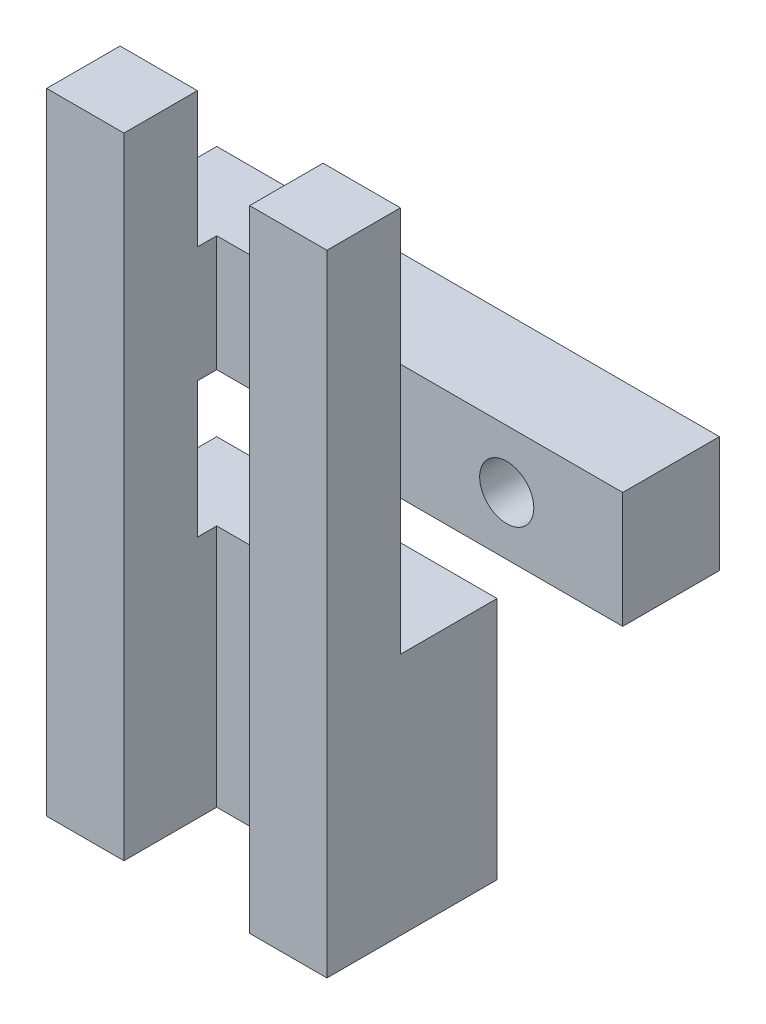
ISO-10303-21;
HEADER;
FILE_DESCRIPTION(('STEP AP214'),'2;1');
FILE_NAME('part.step','',(''),(''),'','','');
FILE_SCHEMA(('AUTOMOTIVE_DESIGN { 1 0 10303 214 1 1 1 1 }'));
ENDSEC;
DATA;
#1=APPLICATION_CONTEXT('core data for automotive mechanical design processes');
#2=APPLICATION_PROTOCOL_DEFINITION('international standard','automotive_design',2000,#1);
#3=PRODUCT_CONTEXT('',#1,'mechanical');
#4=PRODUCT('Part','Part','',(#3));
#5=PRODUCT_RELATED_PRODUCT_CATEGORY('part','',(#4));
#6=PRODUCT_DEFINITION_FORMATION('','',#4);
#7=PRODUCT_DEFINITION_CONTEXT('part definition',#1,'design');
#8=PRODUCT_DEFINITION('design','',#6,#7);
#9=PRODUCT_DEFINITION_SHAPE('','',#8);
#10=(LENGTH_UNIT() NAMED_UNIT(*) SI_UNIT(.MILLI.,.METRE.));
#11=(NAMED_UNIT(*) PLANE_ANGLE_UNIT() SI_UNIT($,.RADIAN.));
#12=(NAMED_UNIT(*) SI_UNIT($,.STERADIAN.) SOLID_ANGLE_UNIT());
#13=UNCERTAINTY_MEASURE_WITH_UNIT(LENGTH_MEASURE(1.E-05),#10,'distance_accuracy_value','');
#14=(GEOMETRIC_REPRESENTATION_CONTEXT(3) GLOBAL_UNCERTAINTY_ASSIGNED_CONTEXT((#13)) GLOBAL_UNIT_ASSIGNED_CONTEXT((#10,
#11,#12)) REPRESENTATION_CONTEXT('',''));
#15=CARTESIAN_POINT('',(0.,0.,0.));
#16=DIRECTION('',(0.,0.,1.));
#17=DIRECTION('',(1.,0.,0.));
#18=AXIS2_PLACEMENT_3D('',#15,#16,#17);
#19=CARTESIAN_POINT('',(0.,0.,5.));
#20=DIRECTION('',(0.,0.,1.));
#21=DIRECTION('',(1.,0.,0.));
#22=AXIS2_PLACEMENT_3D('',#19,#20,#21);
#23=PLANE('',#22);
#24=DIRECTION('',(1.,0.,0.));
#25=VECTOR('',#24,1.);
#26=CARTESIAN_POINT('',(14.5,-13.,5.));
#27=LINE('',#26,#25);
#28=CARTESIAN_POINT('',(0.,-13.,5.));
#29=VERTEX_POINT('',#28);
#30=CARTESIAN_POINT('',(4.,-13.,5.));
#31=VERTEX_POINT('',#30);
#32=EDGE_CURVE('E220',#29,#31,#27,.T.);
#33=ORIENTED_EDGE('',*,*,#32,.F.);
#34=DIRECTION('',(0.,-1.,0.));
#35=VECTOR('',#34,1.);
#36=CARTESIAN_POINT('',(0.,7.,5.));
#37=LINE('',#36,#35);
#38=CARTESIAN_POINT('',(0.,-6.,5.));
#39=VERTEX_POINT('',#38);
#40=EDGE_CURVE('E284',#39,#29,#37,.T.);
#41=ORIENTED_EDGE('',*,*,#40,.F.);
#42=DIRECTION('',(1.,0.,0.));
#43=VECTOR('',#42,1.);
#44=CARTESIAN_POINT('',(0.,-6.,5.));
#45=LINE('',#44,#43);
#46=CARTESIAN_POINT('',(4.,-6.,5.));
#47=VERTEX_POINT('',#46);
#48=EDGE_CURVE('E314',#39,#47,#45,.T.);
#49=ORIENTED_EDGE('',*,*,#48,.T.);
#50=DIRECTION('',(0.,1.,0.));
#51=VECTOR('',#50,1.);
#52=CARTESIAN_POINT('',(4.,7.,5.));
#53=LINE('',#52,#51);
#54=EDGE_CURVE('E299',#31,#47,#53,.T.);
#55=ORIENTED_EDGE('',*,*,#54,.F.);
#56=EDGE_LOOP('',(#33,#41,#49,#55));
#57=FACE_BOUND('',#56,.T.);
#58=ADVANCED_FACE('F41',(#57),#23,.F.);
#59=CARTESIAN_POINT('',(0.,0.,5.));
#60=DIRECTION('',(0.,0.,1.));
#61=DIRECTION('',(1.,0.,0.));
#62=AXIS2_PLACEMENT_3D('',#59,#60,#61);
#63=PLANE('',#62);
#64=CARTESIAN_POINT('',(10.5,-13.,5.));
#65=VERTEX_POINT('',#64);
#66=CARTESIAN_POINT('',(14.5,-13.,5.));
#67=VERTEX_POINT('',#66);
#68=EDGE_CURVE('E214',#65,#67,#27,.T.);
#69=ORIENTED_EDGE('',*,*,#68,.F.);
#70=DIRECTION('',(0.,-1.,0.));
#71=VECTOR('',#70,1.);
#72=CARTESIAN_POINT('',(10.5,7.,5.));
#73=LINE('',#72,#71);
#74=CARTESIAN_POINT('',(10.5,-6.,5.));
#75=VERTEX_POINT('',#74);
#76=EDGE_CURVE('E269',#75,#65,#73,.T.);
#77=ORIENTED_EDGE('',*,*,#76,.F.);
#78=DIRECTION('',(1.,0.,0.));
#79=VECTOR('',#78,1.);
#80=CARTESIAN_POINT('',(0.,-6.,5.));
#81=LINE('',#80,#79);
#82=CARTESIAN_POINT('',(14.5,-6.,5.));
#83=VERTEX_POINT('',#82);
#84=EDGE_CURVE('E274',#75,#83,#81,.T.);
#85=ORIENTED_EDGE('',*,*,#84,.T.);
#86=DIRECTION('',(0.,1.,0.));
#87=VECTOR('',#86,1.);
#88=CARTESIAN_POINT('',(14.5,7.,5.));
#89=LINE('',#88,#87);
#90=EDGE_CURVE('E267',#67,#83,#89,.T.);
#91=ORIENTED_EDGE('',*,*,#90,.F.);
#92=EDGE_LOOP('',(#69,#77,#85,#91));
#93=FACE_BOUND('',#92,.T.);
#94=ADVANCED_FACE('F395',(#93),#63,.F.);
#95=CARTESIAN_POINT('',(0.,0.,5.));
#96=DIRECTION('',(0.,0.,1.));
#97=DIRECTION('',(1.,0.,0.));
#98=AXIS2_PLACEMENT_3D('',#95,#96,#97);
#99=PLANE('',#98);
#100=CARTESIAN_POINT('',(20.,-3.,5.));
#101=DIRECTION('',(0.,0.,1.));
#102=DIRECTION('',(1.,0.,0.));
#103=AXIS2_PLACEMENT_3D('',#100,#101,#102);
#104=CIRCLE('',#103,1.4);
#105=CARTESIAN_POINT('',(21.4,-3.,5.));
#106=VERTEX_POINT('',#105);
#107=EDGE_CURVE('E308',#106,#106,#104,.T.);
#108=ORIENTED_EDGE('',*,*,#107,.F.);
#109=EDGE_LOOP('',(#108));
#110=FACE_BOUND('',#109,.T.);
#111=DIRECTION('',(-1.,0.,0.));
#112=VECTOR('',#111,1.);
#113=CARTESIAN_POINT('',(0.,0.,5.));
#114=LINE('',#113,#112);
#115=CARTESIAN_POINT('',(26.,0.,5.));
#116=VERTEX_POINT('',#115);
#117=CARTESIAN_POINT('',(14.5,0.,5.));
#118=VERTEX_POINT('',#117);
#119=EDGE_CURVE('E321',#116,#118,#114,.T.);
#120=ORIENTED_EDGE('',*,*,#119,.T.);
#121=EDGE_CURVE('E270',#83,#118,#89,.T.);
#122=ORIENTED_EDGE('',*,*,#121,.F.);
#123=CARTESIAN_POINT('',(26.,-6.,5.));
#124=VERTEX_POINT('',#123);
#125=EDGE_CURVE('E318',#83,#124,#45,.T.);
#126=ORIENTED_EDGE('',*,*,#125,.T.);
#127=DIRECTION('',(0.,1.,0.));
#128=VECTOR('',#127,1.);
#129=CARTESIAN_POINT('',(26.,0.,5.));
#130=LINE('',#129,#128);
#131=EDGE_CURVE('E317',#124,#116,#130,.T.);
#132=ORIENTED_EDGE('',*,*,#131,.T.);
#133=EDGE_LOOP('',(#120,#122,#126,#132));
#134=FACE_BOUND('',#133,.T.);
#135=ADVANCED_FACE('F387',(#110,#134),#99,.T.);
#136=CARTESIAN_POINT('',(0.,0.,0.));
#137=DIRECTION('',(0.,0.,1.));
#138=DIRECTION('',(1.,0.,0.));
#139=AXIS2_PLACEMENT_3D('',#136,#137,#138);
#140=PLANE('',#139);
#141=DIRECTION('',(0.,-1.,0.));
#142=VECTOR('',#141,1.);
#143=CARTESIAN_POINT('',(0.,0.,0.));
#144=LINE('',#143,#142);
#145=CARTESIAN_POINT('',(0.,0.,0.));
#146=VERTEX_POINT('',#145);
#147=CARTESIAN_POINT('',(0.,-6.,0.));
#148=VERTEX_POINT('',#147);
#149=EDGE_CURVE('E311',#146,#148,#144,.T.);
#150=ORIENTED_EDGE('',*,*,#149,.F.);
#151=DIRECTION('',(-1.,0.,0.));
#152=VECTOR('',#151,1.);
#153=CARTESIAN_POINT('',(0.,0.,0.));
#154=LINE('',#153,#152);
#155=CARTESIAN_POINT('',(26.,0.,0.));
#156=VERTEX_POINT('',#155);
#157=EDGE_CURVE('E332',#156,#146,#154,.T.);
#158=ORIENTED_EDGE('',*,*,#157,.F.);
#159=DIRECTION('',(0.,1.,0.));
#160=VECTOR('',#159,1.);
#161=CARTESIAN_POINT('',(26.,0.,0.));
#162=LINE('',#161,#160);
#163=CARTESIAN_POINT('',(26.,-6.,0.));
#164=VERTEX_POINT('',#163);
#165=EDGE_CURVE('E330',#164,#156,#162,.T.);
#166=ORIENTED_EDGE('',*,*,#165,.F.);
#167=DIRECTION('',(1.,0.,0.));
#168=VECTOR('',#167,1.);
#169=CARTESIAN_POINT('',(0.,-6.,0.));
#170=LINE('',#169,#168);
#171=EDGE_CURVE('E328',#148,#164,#170,.T.);
#172=ORIENTED_EDGE('',*,*,#171,.F.);
#173=EDGE_LOOP('',(#150,#158,#166,#172));
#174=FACE_BOUND('',#173,.T.);
#175=CARTESIAN_POINT('',(20.,-3.,0.));
#176=DIRECTION('',(0.,0.,1.));
#177=DIRECTION('',(1.,0.,0.));
#178=AXIS2_PLACEMENT_3D('',#175,#176,#177);
#179=CIRCLE('',#178,1.4);
#180=CARTESIAN_POINT('',(21.4,-3.,0.));
#181=VERTEX_POINT('',#180);
#182=EDGE_CURVE('E307',#181,#181,#179,.T.);
#183=ORIENTED_EDGE('',*,*,#182,.T.);
#184=EDGE_LOOP('',(#183));
#185=FACE_BOUND('',#184,.T.);
#186=ADVANCED_FACE('F350',(#174,#185),#140,.F.);
#187=CARTESIAN_POINT('',(0.,0.,5.));
#188=DIRECTION('',(1.,0.,0.));
#189=DIRECTION('',(0.,1.,0.));
#190=AXIS2_PLACEMENT_3D('',#187,#188,#189);
#191=PLANE('',#190);
#192=ORIENTED_EDGE('',*,*,#149,.T.);
#193=DIRECTION('',(0.,0.,-1.));
#194=VECTOR('',#193,1.);
#195=CARTESIAN_POINT('',(0.,-6.,5.));
#196=LINE('',#195,#194);
#197=EDGE_CURVE('E11',#39,#148,#196,.T.);
#198=ORIENTED_EDGE('',*,*,#197,.F.);
#199=ORIENTED_EDGE('',*,*,#40,.T.);
#200=DIRECTION('',(0.,0.,1.));
#201=VECTOR('',#200,1.);
#202=CARTESIAN_POINT('',(0.,-13.,0.));
#203=LINE('',#202,#201);
#204=CARTESIAN_POINT('',(0.,-13.,0.));
#205=VERTEX_POINT('',#204);
#206=EDGE_CURVE('E230',#205,#29,#203,.T.);
#207=ORIENTED_EDGE('',*,*,#206,.F.);
#208=DIRECTION('',(0.,1.,0.));
#209=VECTOR('',#208,1.);
#210=CARTESIAN_POINT('',(0.,-13.,0.));
#211=LINE('',#210,#209);
#212=CARTESIAN_POINT('',(0.,-25.6,0.));
#213=VERTEX_POINT('',#212);
#214=EDGE_CURVE('E223',#213,#205,#211,.T.);
#215=ORIENTED_EDGE('',*,*,#214,.F.);
#216=DIRECTION('',(0.,0.,-1.));
#217=VECTOR('',#216,1.);
#218=CARTESIAN_POINT('',(0.,-25.6,8.8));
#219=LINE('',#218,#217);
#220=CARTESIAN_POINT('',(0.,-25.6,8.8));
#221=VERTEX_POINT('',#220);
#222=EDGE_CURVE('E195',#221,#213,#219,.T.);
#223=ORIENTED_EDGE('',*,*,#222,.F.);
#224=DIRECTION('',(0.,-1.,0.));
#225=VECTOR('',#224,1.);
#226=CARTESIAN_POINT('',(0.,7.,8.8));
#227=LINE('',#226,#225);
#228=CARTESIAN_POINT('',(0.,7.,8.8));
#229=VERTEX_POINT('',#228);
#230=EDGE_CURVE('E285',#229,#221,#227,.T.);
#231=ORIENTED_EDGE('',*,*,#230,.F.);
#232=DIRECTION('',(0.,0.,-1.));
#233=VECTOR('',#232,1.);
#234=CARTESIAN_POINT('',(0.,7.,8.8));
#235=LINE('',#234,#233);
#236=CARTESIAN_POINT('',(0.,7.,5.));
#237=VERTEX_POINT('',#236);
#238=EDGE_CURVE('E294',#229,#237,#235,.T.);
#239=ORIENTED_EDGE('',*,*,#238,.T.);
#240=CARTESIAN_POINT('',(0.,0.,5.));
#241=VERTEX_POINT('',#240);
#242=EDGE_CURVE('E295',#237,#241,#37,.T.);
#243=ORIENTED_EDGE('',*,*,#242,.T.);
#244=DIRECTION('',(0.,0.,-1.));
#245=VECTOR('',#244,1.);
#246=CARTESIAN_POINT('',(0.,0.,5.));
#247=LINE('',#246,#245);
#248=EDGE_CURVE('E324',#241,#146,#247,.T.);
#249=ORIENTED_EDGE('',*,*,#248,.T.);
#250=EDGE_LOOP('',(#192,#198,#199,#207,#215,#223,#231,#239,#243,#249));
#251=FACE_BOUND('',#250,.T.);
#252=ADVANCED_FACE('F43',(#251),#191,.F.);
#253=CARTESIAN_POINT('',(0.,-6.,5.));
#254=DIRECTION('',(0.,1.,0.));
#255=DIRECTION('',(0.,0.,1.));
#256=AXIS2_PLACEMENT_3D('',#253,#254,#255);
#257=PLANE('',#256);
#258=DIRECTION('',(1.,0.,0.));
#259=VECTOR('',#258,1.);
#260=CARTESIAN_POINT('',(4.,-6.,4.));
#261=LINE('',#260,#259);
#262=CARTESIAN_POINT('',(4.,-6.,4.));
#263=VERTEX_POINT('',#262);
#264=CARTESIAN_POINT('',(10.5,-6.,4.));
#265=VERTEX_POINT('',#264);
#266=EDGE_CURVE('E235',#263,#265,#261,.T.);
#267=ORIENTED_EDGE('',*,*,#266,.F.);
#268=DIRECTION('',(0.,0.,1.));
#269=VECTOR('',#268,1.);
#270=CARTESIAN_POINT('',(4.,-6.,4.));
#271=LINE('',#270,#269);
#272=EDGE_CURVE('E244',#263,#47,#271,.T.);
#273=ORIENTED_EDGE('',*,*,#272,.T.);
#274=ORIENTED_EDGE('',*,*,#48,.F.);
#275=ORIENTED_EDGE('',*,*,#197,.T.);
#276=ORIENTED_EDGE('',*,*,#171,.T.);
#277=DIRECTION('',(0.,0.,-1.));
#278=VECTOR('',#277,1.);
#279=CARTESIAN_POINT('',(26.,-6.,5.));
#280=LINE('',#279,#278);
#281=EDGE_CURVE('E49',#124,#164,#280,.T.);
#282=ORIENTED_EDGE('',*,*,#281,.F.);
#283=ORIENTED_EDGE('',*,*,#125,.F.);
#284=ORIENTED_EDGE('',*,*,#84,.F.);
#285=DIRECTION('',(0.,0.,1.));
#286=VECTOR('',#285,1.);
#287=CARTESIAN_POINT('',(10.5,-6.,4.));
#288=LINE('',#287,#286);
#289=EDGE_CURVE('E249',#265,#75,#288,.T.);
#290=ORIENTED_EDGE('',*,*,#289,.F.);
#291=EDGE_LOOP('',(#267,#273,#274,#275,#276,#282,#283,#284,#290));
#292=FACE_BOUND('',#291,.T.);
#293=ADVANCED_FACE('F390',(#292),#257,.F.);
#294=CARTESIAN_POINT('',(26.,0.,5.));
#295=DIRECTION('',(-1.,0.,0.));
#296=DIRECTION('',(0.,0.,1.));
#297=AXIS2_PLACEMENT_3D('',#294,#295,#296);
#298=PLANE('',#297);
#299=ORIENTED_EDGE('',*,*,#165,.T.);
#300=DIRECTION('',(0.,0.,-1.));
#301=VECTOR('',#300,1.);
#302=CARTESIAN_POINT('',(26.,0.,5.));
#303=LINE('',#302,#301);
#304=EDGE_CURVE('E336',#116,#156,#303,.T.);
#305=ORIENTED_EDGE('',*,*,#304,.F.);
#306=ORIENTED_EDGE('',*,*,#131,.F.);
#307=ORIENTED_EDGE('',*,*,#281,.T.);
#308=EDGE_LOOP('',(#299,#305,#306,#307));
#309=FACE_BOUND('',#308,.T.);
#310=ADVANCED_FACE('F343',(#309),#298,.F.);
#311=CARTESIAN_POINT('',(0.,0.,5.));
#312=DIRECTION('',(0.,-1.,0.));
#313=DIRECTION('',(0.,0.,-1.));
#314=AXIS2_PLACEMENT_3D('',#311,#312,#313);
#315=PLANE('',#314);
#316=CARTESIAN_POINT('',(4.,0.,5.));
#317=VERTEX_POINT('',#316);
#318=EDGE_CURVE('E320',#317,#241,#114,.T.);
#319=ORIENTED_EDGE('',*,*,#318,.F.);
#320=DIRECTION('',(0.,0.,1.));
#321=VECTOR('',#320,1.);
#322=CARTESIAN_POINT('',(4.,0.,4.));
#323=LINE('',#322,#321);
#324=CARTESIAN_POINT('',(4.,0.,4.));
#325=VERTEX_POINT('',#324);
#326=EDGE_CURVE('E245',#325,#317,#323,.T.);
#327=ORIENTED_EDGE('',*,*,#326,.F.);
#328=DIRECTION('',(-1.,0.,0.));
#329=VECTOR('',#328,1.);
#330=CARTESIAN_POINT('',(4.,0.,4.));
#331=LINE('',#330,#329);
#332=CARTESIAN_POINT('',(10.5,0.,4.));
#333=VERTEX_POINT('',#332);
#334=EDGE_CURVE('E241',#333,#325,#331,.T.);
#335=ORIENTED_EDGE('',*,*,#334,.F.);
#336=DIRECTION('',(0.,0.,1.));
#337=VECTOR('',#336,1.);
#338=CARTESIAN_POINT('',(10.5,0.,4.));
#339=LINE('',#338,#337);
#340=CARTESIAN_POINT('',(10.5,0.,5.));
#341=VERTEX_POINT('',#340);
#342=EDGE_CURVE('E247',#333,#341,#339,.T.);
#343=ORIENTED_EDGE('',*,*,#342,.T.);
#344=EDGE_CURVE('E325',#118,#341,#114,.T.);
#345=ORIENTED_EDGE('',*,*,#344,.F.);
#346=ORIENTED_EDGE('',*,*,#119,.F.);
#347=ORIENTED_EDGE('',*,*,#304,.T.);
#348=ORIENTED_EDGE('',*,*,#157,.T.);
#349=ORIENTED_EDGE('',*,*,#248,.F.);
#350=EDGE_LOOP('',(#319,#327,#335,#343,#345,#346,#347,#348,#349));
#351=FACE_BOUND('',#350,.T.);
#352=ADVANCED_FACE('F354',(#351),#315,.F.);
#353=CARTESIAN_POINT('',(20.,-3.,5.));
#354=DIRECTION('',(0.,0.,-1.));
#355=DIRECTION('',(-1.,0.,0.));
#356=AXIS2_PLACEMENT_3D('',#353,#354,#355);
#357=CYLINDRICAL_SURFACE('',#356,1.4);
#358=ORIENTED_EDGE('',*,*,#107,.T.);
#359=EDGE_LOOP('',(#358));
#360=FACE_BOUND('',#359,.T.);
#361=ORIENTED_EDGE('',*,*,#182,.F.);
#362=EDGE_LOOP('',(#361));
#363=FACE_BOUND('',#362,.T.);
#364=ADVANCED_FACE('F437',(#360,#363),#357,.F.);
#365=CARTESIAN_POINT('',(4.,7.,5.));
#366=VERTEX_POINT('',#365);
#367=EDGE_CURVE('E298',#317,#366,#53,.T.);
#368=ORIENTED_EDGE('',*,*,#367,.F.);
#369=ORIENTED_EDGE('',*,*,#318,.T.);
#370=ORIENTED_EDGE('',*,*,#242,.F.);
#371=DIRECTION('',(-1.,0.,0.));
#372=VECTOR('',#371,1.);
#373=CARTESIAN_POINT('',(0.,7.,5.));
#374=LINE('',#373,#372);
#375=EDGE_CURVE('E289',#366,#237,#374,.T.);
#376=ORIENTED_EDGE('',*,*,#375,.F.);
#377=EDGE_LOOP('',(#368,#369,#370,#376));
#378=FACE_BOUND('',#377,.T.);
#379=ADVANCED_FACE('F365',(#378),#23,.F.);
#380=CARTESIAN_POINT('',(0.,-25.6,8.8));
#381=DIRECTION('',(0.,1.,0.));
#382=DIRECTION('',(0.,0.,1.));
#383=AXIS2_PLACEMENT_3D('',#380,#381,#382);
#384=PLANE('',#383);
#385=DIRECTION('',(1.,0.,0.));
#386=VECTOR('',#385,1.);
#387=CARTESIAN_POINT('',(4.,-25.6,4.));
#388=LINE('',#387,#386);
#389=CARTESIAN_POINT('',(4.,-25.6,4.));
#390=VERTEX_POINT('',#389);
#391=CARTESIAN_POINT('',(10.5,-25.6,4.));
#392=VERTEX_POINT('',#391);
#393=EDGE_CURVE('E199',#390,#392,#388,.T.);
#394=ORIENTED_EDGE('',*,*,#393,.F.);
#395=DIRECTION('',(0.,0.,-1.));
#396=VECTOR('',#395,1.);
#397=CARTESIAN_POINT('',(4.,-25.6,8.8));
#398=LINE('',#397,#396);
#399=CARTESIAN_POINT('',(4.,-25.6,8.8));
#400=VERTEX_POINT('',#399);
#401=EDGE_CURVE('E187',#400,#390,#398,.T.);
#402=ORIENTED_EDGE('',*,*,#401,.F.);
#403=DIRECTION('',(1.,0.,0.));
#404=VECTOR('',#403,1.);
#405=CARTESIAN_POINT('',(0.,-25.6,8.8));
#406=LINE('',#405,#404);
#407=EDGE_CURVE('E288',#221,#400,#406,.T.);
#408=ORIENTED_EDGE('',*,*,#407,.F.);
#409=ORIENTED_EDGE('',*,*,#222,.T.);
#410=DIRECTION('',(-1.,0.,0.));
#411=VECTOR('',#410,1.);
#412=CARTESIAN_POINT('',(14.5,-25.6,0.));
#413=LINE('',#412,#411);
#414=CARTESIAN_POINT('',(14.5,-25.6,0.));
#415=VERTEX_POINT('',#414);
#416=EDGE_CURVE('E219',#415,#213,#413,.T.);
#417=ORIENTED_EDGE('',*,*,#416,.F.);
#418=DIRECTION('',(0.,0.,-1.));
#419=VECTOR('',#418,1.);
#420=CARTESIAN_POINT('',(14.5,-25.6,8.8));
#421=LINE('',#420,#419);
#422=CARTESIAN_POINT('',(14.5,-25.6,8.8));
#423=VERTEX_POINT('',#422);
#424=EDGE_CURVE('E254',#423,#415,#421,.T.);
#425=ORIENTED_EDGE('',*,*,#424,.F.);
#426=DIRECTION('',(1.,0.,0.));
#427=VECTOR('',#426,1.);
#428=CARTESIAN_POINT('',(10.5,-25.6,8.8));
#429=LINE('',#428,#427);
#430=CARTESIAN_POINT('',(10.5,-25.6,8.8));
#431=VERTEX_POINT('',#430);
#432=EDGE_CURVE('E278',#431,#423,#429,.T.);
#433=ORIENTED_EDGE('',*,*,#432,.F.);
#434=DIRECTION('',(0.,0.,-1.));
#435=VECTOR('',#434,1.);
#436=CARTESIAN_POINT('',(10.5,-25.6,8.8));
#437=LINE('',#436,#435);
#438=EDGE_CURVE('E206',#431,#392,#437,.T.);
#439=ORIENTED_EDGE('',*,*,#438,.T.);
#440=EDGE_LOOP('',(#394,#402,#408,#409,#417,#425,#433,#439));
#441=FACE_BOUND('',#440,.T.);
#442=ADVANCED_FACE('F204',(#441),#384,.F.);
#443=CARTESIAN_POINT('',(4.,7.,8.8));
#444=DIRECTION('',(-1.,0.,0.));
#445=DIRECTION('',(0.,-1.,0.));
#446=AXIS2_PLACEMENT_3D('',#443,#444,#445);
#447=PLANE('',#446);
#448=ORIENTED_EDGE('',*,*,#401,.T.);
#449=DIRECTION('',(0.,-1.,0.));
#450=VECTOR('',#449,1.);
#451=CARTESIAN_POINT('',(4.,-13.,4.));
#452=LINE('',#451,#450);
#453=CARTESIAN_POINT('',(4.,-13.,4.));
#454=VERTEX_POINT('',#453);
#455=EDGE_CURVE('E190',#454,#390,#452,.T.);
#456=ORIENTED_EDGE('',*,*,#455,.F.);
#457=DIRECTION('',(0.,0.,1.));
#458=VECTOR('',#457,1.);
#459=CARTESIAN_POINT('',(4.,-13.,4.));
#460=LINE('',#459,#458);
#461=EDGE_CURVE('E212',#454,#31,#460,.T.);
#462=ORIENTED_EDGE('',*,*,#461,.T.);
#463=ORIENTED_EDGE('',*,*,#54,.T.);
#464=ORIENTED_EDGE('',*,*,#272,.F.);
#465=DIRECTION('',(0.,-1.,0.));
#466=VECTOR('',#465,1.);
#467=CARTESIAN_POINT('',(4.,0.,4.));
#468=LINE('',#467,#466);
#469=EDGE_CURVE('E232',#325,#263,#468,.T.);
#470=ORIENTED_EDGE('',*,*,#469,.F.);
#471=ORIENTED_EDGE('',*,*,#326,.T.);
#472=ORIENTED_EDGE('',*,*,#367,.T.);
#473=DIRECTION('',(0.,0.,-1.));
#474=VECTOR('',#473,1.);
#475=CARTESIAN_POINT('',(4.,7.,8.8));
#476=LINE('',#475,#474);
#477=CARTESIAN_POINT('',(4.,7.,8.8));
#478=VERTEX_POINT('',#477);
#479=EDGE_CURVE('E196',#478,#366,#476,.T.);
#480=ORIENTED_EDGE('',*,*,#479,.F.);
#481=DIRECTION('',(0.,1.,0.));
#482=VECTOR('',#481,1.);
#483=CARTESIAN_POINT('',(4.,7.,8.8));
#484=LINE('',#483,#482);
#485=EDGE_CURVE('E192',#400,#478,#484,.T.);
#486=ORIENTED_EDGE('',*,*,#485,.F.);
#487=EDGE_LOOP('',(#448,#456,#462,#463,#464,#470,#471,#472,#480,#486));
#488=FACE_BOUND('',#487,.T.);
#489=ADVANCED_FACE('F189',(#488),#447,.F.);
#490=CARTESIAN_POINT('',(0.,7.,8.8));
#491=DIRECTION('',(0.,-1.,0.));
#492=DIRECTION('',(0.,0.,-1.));
#493=AXIS2_PLACEMENT_3D('',#490,#491,#492);
#494=PLANE('',#493);
#495=ORIENTED_EDGE('',*,*,#375,.T.);
#496=ORIENTED_EDGE('',*,*,#238,.F.);
#497=DIRECTION('',(-1.,0.,0.));
#498=VECTOR('',#497,1.);
#499=CARTESIAN_POINT('',(0.,7.,8.8));
#500=LINE('',#499,#498);
#501=EDGE_CURVE('E292',#478,#229,#500,.T.);
#502=ORIENTED_EDGE('',*,*,#501,.F.);
#503=ORIENTED_EDGE('',*,*,#479,.T.);
#504=EDGE_LOOP('',(#495,#496,#502,#503));
#505=FACE_BOUND('',#504,.T.);
#506=ADVANCED_FACE('F419',(#505),#494,.F.);
#507=CARTESIAN_POINT('',(0.,0.,8.8));
#508=DIRECTION('',(0.,0.,1.));
#509=DIRECTION('',(1.,0.,0.));
#510=AXIS2_PLACEMENT_3D('',#507,#508,#509);
#511=PLANE('',#510);
#512=ORIENTED_EDGE('',*,*,#230,.T.);
#513=ORIENTED_EDGE('',*,*,#407,.T.);
#514=ORIENTED_EDGE('',*,*,#485,.T.);
#515=ORIENTED_EDGE('',*,*,#501,.T.);
#516=EDGE_LOOP('',(#512,#513,#514,#515));
#517=FACE_BOUND('',#516,.T.);
#518=ADVANCED_FACE('F416',(#517),#511,.T.);
#519=CARTESIAN_POINT('',(14.5,7.,5.));
#520=VERTEX_POINT('',#519);
#521=EDGE_CURVE('E265',#118,#520,#89,.T.);
#522=ORIENTED_EDGE('',*,*,#521,.F.);
#523=ORIENTED_EDGE('',*,*,#344,.T.);
#524=CARTESIAN_POINT('',(10.5,7.,5.));
#525=VERTEX_POINT('',#524);
#526=EDGE_CURVE('E271',#525,#341,#73,.T.);
#527=ORIENTED_EDGE('',*,*,#526,.F.);
#528=DIRECTION('',(-1.,0.,0.));
#529=VECTOR('',#528,1.);
#530=CARTESIAN_POINT('',(10.5,7.,5.));
#531=LINE('',#530,#529);
#532=EDGE_CURVE('E263',#520,#525,#531,.T.);
#533=ORIENTED_EDGE('',*,*,#532,.F.);
#534=EDGE_LOOP('',(#522,#523,#527,#533));
#535=FACE_BOUND('',#534,.T.);
#536=ADVANCED_FACE('F371',(#535),#63,.F.);
#537=CARTESIAN_POINT('',(10.5,7.,8.8));
#538=DIRECTION('',(1.,0.,0.));
#539=DIRECTION('',(0.,1.,0.));
#540=AXIS2_PLACEMENT_3D('',#537,#538,#539);
#541=PLANE('',#540);
#542=ORIENTED_EDGE('',*,*,#526,.T.);
#543=ORIENTED_EDGE('',*,*,#342,.F.);
#544=DIRECTION('',(0.,1.,0.));
#545=VECTOR('',#544,1.);
#546=CARTESIAN_POINT('',(10.5,0.,4.));
#547=LINE('',#546,#545);
#548=EDGE_CURVE('E238',#265,#333,#547,.T.);
#549=ORIENTED_EDGE('',*,*,#548,.F.);
#550=ORIENTED_EDGE('',*,*,#289,.T.);
#551=ORIENTED_EDGE('',*,*,#76,.T.);
#552=DIRECTION('',(0.,0.,1.));
#553=VECTOR('',#552,1.);
#554=CARTESIAN_POINT('',(10.5,-13.,4.));
#555=LINE('',#554,#553);
#556=CARTESIAN_POINT('',(10.5,-13.,4.));
#557=VERTEX_POINT('',#556);
#558=EDGE_CURVE('E211',#557,#65,#555,.T.);
#559=ORIENTED_EDGE('',*,*,#558,.F.);
#560=DIRECTION('',(0.,1.,0.));
#561=VECTOR('',#560,1.);
#562=CARTESIAN_POINT('',(10.5,-13.,4.));
#563=LINE('',#562,#561);
#564=EDGE_CURVE('E56',#392,#557,#563,.T.);
#565=ORIENTED_EDGE('',*,*,#564,.F.);
#566=ORIENTED_EDGE('',*,*,#438,.F.);
#567=DIRECTION('',(0.,-1.,0.));
#568=VECTOR('',#567,1.);
#569=CARTESIAN_POINT('',(10.5,7.,8.8));
#570=LINE('',#569,#568);
#571=CARTESIAN_POINT('',(10.5,7.,8.8));
#572=VERTEX_POINT('',#571);
#573=EDGE_CURVE('E266',#572,#431,#570,.T.);
#574=ORIENTED_EDGE('',*,*,#573,.F.);
#575=DIRECTION('',(0.,0.,-1.));
#576=VECTOR('',#575,1.);
#577=CARTESIAN_POINT('',(10.5,7.,8.8));
#578=LINE('',#577,#576);
#579=EDGE_CURVE('E259',#572,#525,#578,.T.);
#580=ORIENTED_EDGE('',*,*,#579,.T.);
#581=EDGE_LOOP('',(#542,#543,#549,#550,#551,#559,#565,#566,#574,#580));
#582=FACE_BOUND('',#581,.T.);
#583=ADVANCED_FACE('F375',(#582),#541,.F.);
#584=CARTESIAN_POINT('',(14.5,7.,8.8));
#585=DIRECTION('',(-1.,0.,0.));
#586=DIRECTION('',(0.,-1.,0.));
#587=AXIS2_PLACEMENT_3D('',#584,#585,#586);
#588=PLANE('',#587);
#589=ORIENTED_EDGE('',*,*,#424,.T.);
#590=DIRECTION('',(0.,-1.,0.));
#591=VECTOR('',#590,1.);
#592=CARTESIAN_POINT('',(14.5,-13.,0.));
#593=LINE('',#592,#591);
#594=CARTESIAN_POINT('',(14.5,-13.,0.));
#595=VERTEX_POINT('',#594);
#596=EDGE_CURVE('E216',#595,#415,#593,.T.);
#597=ORIENTED_EDGE('',*,*,#596,.F.);
#598=DIRECTION('',(0.,0.,1.));
#599=VECTOR('',#598,1.);
#600=CARTESIAN_POINT('',(14.5,-13.,0.));
#601=LINE('',#600,#599);
#602=EDGE_CURVE('E64',#595,#67,#601,.T.);
#603=ORIENTED_EDGE('',*,*,#602,.T.);
#604=ORIENTED_EDGE('',*,*,#90,.T.);
#605=ORIENTED_EDGE('',*,*,#121,.T.);
#606=ORIENTED_EDGE('',*,*,#521,.T.);
#607=DIRECTION('',(0.,0.,-1.));
#608=VECTOR('',#607,1.);
#609=CARTESIAN_POINT('',(14.5,7.,8.8));
#610=LINE('',#609,#608);
#611=CARTESIAN_POINT('',(14.5,7.,8.8));
#612=VERTEX_POINT('',#611);
#613=EDGE_CURVE('E256',#612,#520,#610,.T.);
#614=ORIENTED_EDGE('',*,*,#613,.F.);
#615=DIRECTION('',(0.,1.,0.));
#616=VECTOR('',#615,1.);
#617=CARTESIAN_POINT('',(14.5,7.,8.8));
#618=LINE('',#617,#616);
#619=EDGE_CURVE('E276',#423,#612,#618,.T.);
#620=ORIENTED_EDGE('',*,*,#619,.F.);
#621=EDGE_LOOP('',(#589,#597,#603,#604,#605,#606,#614,#620));
#622=FACE_BOUND('',#621,.T.);
#623=ADVANCED_FACE('F383',(#622),#588,.F.);
#624=CARTESIAN_POINT('',(10.5,7.,8.8));
#625=DIRECTION('',(0.,-1.,0.));
#626=DIRECTION('',(0.,0.,-1.));
#627=AXIS2_PLACEMENT_3D('',#624,#625,#626);
#628=PLANE('',#627);
#629=ORIENTED_EDGE('',*,*,#532,.T.);
#630=ORIENTED_EDGE('',*,*,#579,.F.);
#631=DIRECTION('',(-1.,0.,0.));
#632=VECTOR('',#631,1.);
#633=CARTESIAN_POINT('',(10.5,7.,8.8));
#634=LINE('',#633,#632);
#635=EDGE_CURVE('E262',#612,#572,#634,.T.);
#636=ORIENTED_EDGE('',*,*,#635,.F.);
#637=ORIENTED_EDGE('',*,*,#613,.T.);
#638=EDGE_LOOP('',(#629,#630,#636,#637));
#639=FACE_BOUND('',#638,.T.);
#640=ADVANCED_FACE('F380',(#639),#628,.F.);
#641=CARTESIAN_POINT('',(0.,0.,8.8));
#642=DIRECTION('',(0.,0.,1.));
#643=DIRECTION('',(1.,0.,0.));
#644=AXIS2_PLACEMENT_3D('',#641,#642,#643);
#645=PLANE('',#644);
#646=ORIENTED_EDGE('',*,*,#573,.T.);
#647=ORIENTED_EDGE('',*,*,#432,.T.);
#648=ORIENTED_EDGE('',*,*,#619,.T.);
#649=ORIENTED_EDGE('',*,*,#635,.T.);
#650=EDGE_LOOP('',(#646,#647,#648,#649));
#651=FACE_BOUND('',#650,.T.);
#652=ADVANCED_FACE('F520',(#651),#645,.T.);
#653=CARTESIAN_POINT('',(0.,0.,4.));
#654=DIRECTION('',(0.,0.,1.));
#655=DIRECTION('',(1.,0.,0.));
#656=AXIS2_PLACEMENT_3D('',#653,#654,#655);
#657=PLANE('',#656);
#658=ORIENTED_EDGE('',*,*,#469,.T.);
#659=ORIENTED_EDGE('',*,*,#266,.T.);
#660=ORIENTED_EDGE('',*,*,#548,.T.);
#661=ORIENTED_EDGE('',*,*,#334,.T.);
#662=EDGE_LOOP('',(#658,#659,#660,#661));
#663=FACE_BOUND('',#662,.T.);
#664=ADVANCED_FACE('F398',(#663),#657,.T.);
#665=CARTESIAN_POINT('',(14.5,-13.,0.));
#666=DIRECTION('',(0.,-1.,0.));
#667=DIRECTION('',(1.,0.,0.));
#668=AXIS2_PLACEMENT_3D('',#665,#666,#667);
#669=PLANE('',#668);
#670=ORIENTED_EDGE('',*,*,#32,.T.);
#671=ORIENTED_EDGE('',*,*,#461,.F.);
#672=DIRECTION('',(-1.,0.,0.));
#673=VECTOR('',#672,1.);
#674=CARTESIAN_POINT('',(4.,-13.,4.));
#675=LINE('',#674,#673);
#676=EDGE_CURVE('E201',#557,#454,#675,.T.);
#677=ORIENTED_EDGE('',*,*,#676,.F.);
#678=ORIENTED_EDGE('',*,*,#558,.T.);
#679=ORIENTED_EDGE('',*,*,#68,.T.);
#680=ORIENTED_EDGE('',*,*,#602,.F.);
#681=DIRECTION('',(1.,0.,0.));
#682=VECTOR('',#681,1.);
#683=CARTESIAN_POINT('',(14.5,-13.,0.));
#684=LINE('',#683,#682);
#685=EDGE_CURVE('E225',#205,#595,#684,.T.);
#686=ORIENTED_EDGE('',*,*,#685,.F.);
#687=ORIENTED_EDGE('',*,*,#206,.T.);
#688=EDGE_LOOP('',(#670,#671,#677,#678,#679,#680,#686,#687));
#689=FACE_BOUND('',#688,.T.);
#690=ADVANCED_FACE('F410',(#689),#669,.F.);
#691=CARTESIAN_POINT('',(0.,0.,0.));
#692=DIRECTION('',(0.,0.,-1.));
#693=DIRECTION('',(-1.,0.,0.));
#694=AXIS2_PLACEMENT_3D('',#691,#692,#693);
#695=PLANE('',#694);
#696=ORIENTED_EDGE('',*,*,#596,.T.);
#697=ORIENTED_EDGE('',*,*,#416,.T.);
#698=ORIENTED_EDGE('',*,*,#214,.T.);
#699=ORIENTED_EDGE('',*,*,#685,.T.);
#700=EDGE_LOOP('',(#696,#697,#698,#699));
#701=FACE_BOUND('',#700,.T.);
#702=ADVANCED_FACE('F412',(#701),#695,.T.);
#703=CARTESIAN_POINT('',(0.,0.,4.));
#704=DIRECTION('',(0.,0.,1.));
#705=DIRECTION('',(1.,0.,0.));
#706=AXIS2_PLACEMENT_3D('',#703,#704,#705);
#707=PLANE('',#706);
#708=ORIENTED_EDGE('',*,*,#455,.T.);
#709=ORIENTED_EDGE('',*,*,#393,.T.);
#710=ORIENTED_EDGE('',*,*,#564,.T.);
#711=ORIENTED_EDGE('',*,*,#676,.T.);
#712=EDGE_LOOP('',(#708,#709,#710,#711));
#713=FACE_BOUND('',#712,.T.);
#714=ADVANCED_FACE('F198',(#713),#707,.T.);
#715=CLOSED_SHELL('',(#58,#94,#135,#186,#252,#293,#310,#352,#364,#379,#442,#489,#506,#518,#536,
#583,#623,#640,#652,#664,#690,#702,#714));
#716=MANIFOLD_SOLID_BREP('B2',#715);
#717=ADVANCED_BREP_SHAPE_REPRESENTATION('',(#18,#716),#14);
#718=SHAPE_DEFINITION_REPRESENTATION(#9,#717);
ENDSEC;
END-ISO-10303-21;
